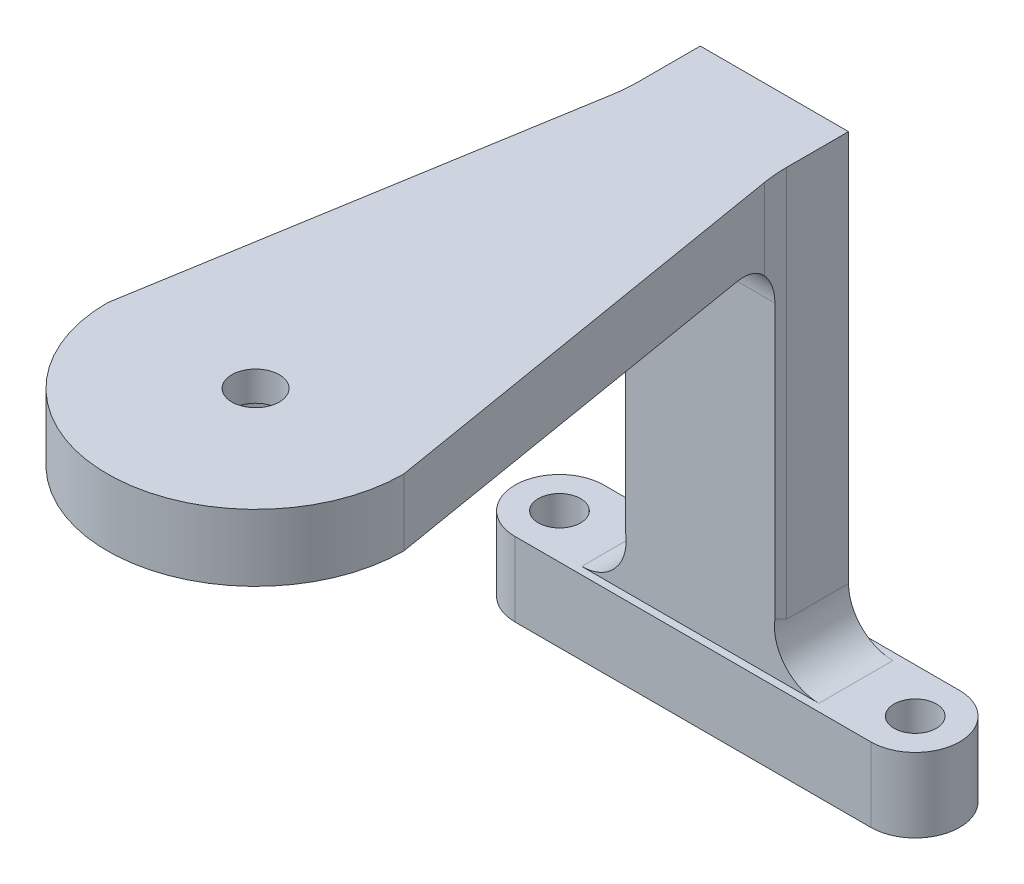
ISO-10303-21;
HEADER;
FILE_DESCRIPTION(('STEP AP214'),'2;1');
FILE_NAME('part.step','',(''),(''),'','','');
FILE_SCHEMA(('AUTOMOTIVE_DESIGN { 1 0 10303 214 1 1 1 1 }'));
ENDSEC;
DATA;
#1=APPLICATION_CONTEXT('core data for automotive mechanical design processes');
#2=APPLICATION_PROTOCOL_DEFINITION('international standard','automotive_design',2000,#1);
#3=PRODUCT_CONTEXT('',#1,'mechanical');
#4=PRODUCT('Part','Part','',(#3));
#5=PRODUCT_RELATED_PRODUCT_CATEGORY('part','',(#4));
#6=PRODUCT_DEFINITION_FORMATION('','',#4);
#7=PRODUCT_DEFINITION_CONTEXT('part definition',#1,'design');
#8=PRODUCT_DEFINITION('design','',#6,#7);
#9=PRODUCT_DEFINITION_SHAPE('','',#8);
#10=(LENGTH_UNIT() NAMED_UNIT(*) SI_UNIT(.MILLI.,.METRE.));
#11=(NAMED_UNIT(*) PLANE_ANGLE_UNIT() SI_UNIT($,.RADIAN.));
#12=(NAMED_UNIT(*) SI_UNIT($,.STERADIAN.) SOLID_ANGLE_UNIT());
#13=UNCERTAINTY_MEASURE_WITH_UNIT(LENGTH_MEASURE(1.E-05),#10,'distance_accuracy_value','');
#14=(GEOMETRIC_REPRESENTATION_CONTEXT(3) GLOBAL_UNCERTAINTY_ASSIGNED_CONTEXT((#13)) GLOBAL_UNIT_ASSIGNED_CONTEXT((#10,
#11,#12)) REPRESENTATION_CONTEXT('',''));
#15=CARTESIAN_POINT('',(0.,0.,0.));
#16=DIRECTION('',(0.,0.,1.));
#17=DIRECTION('',(1.,0.,0.));
#18=AXIS2_PLACEMENT_3D('',#15,#16,#17);
#19=CARTESIAN_POINT('',(10.,0.,0.));
#20=DIRECTION('',(0.,1.,0.));
#21=DIRECTION('',(0.,0.,1.));
#22=AXIS2_PLACEMENT_3D('',#19,#20,#21);
#23=PLANE('',#22);
#24=DIRECTION('',(0.164398987305357,0.,-0.986393923832144));
#25=VECTOR('',#24,1.);
#26=CARTESIAN_POINT('',(0.270270270270269,0.,-1.62162162162162));
#27=LINE('',#26,#25);
#28=CARTESIAN_POINT('',(0.,0.,0.));
#29=VERTEX_POINT('',#28);
#30=CARTESIAN_POINT('',(4.5,0.,-27.));
#31=VERTEX_POINT('',#30);
#32=EDGE_CURVE('E173',#29,#31,#27,.T.);
#33=ORIENTED_EDGE('',*,*,#32,.T.);
#34=DIRECTION('',(-1.,0.,0.));
#35=VECTOR('',#34,1.);
#36=CARTESIAN_POINT('',(15.,0.,-27.));
#37=LINE('',#36,#35);
#38=CARTESIAN_POINT('',(15.5,0.,-27.));
#39=VERTEX_POINT('',#38);
#40=EDGE_CURVE('E229',#31,#39,#37,.F.);
#41=ORIENTED_EDGE('',*,*,#40,.T.);
#42=DIRECTION('',(0.164398987305357,0.,0.986393923832144));
#43=VECTOR('',#42,1.);
#44=CARTESIAN_POINT('',(19.7297297297297,0.,-1.62162162162162));
#45=LINE('',#44,#43);
#46=CARTESIAN_POINT('',(20.,0.,0.));
#47=VERTEX_POINT('',#46);
#48=EDGE_CURVE('E612',#39,#47,#45,.T.);
#49=ORIENTED_EDGE('',*,*,#48,.T.);
#50=CARTESIAN_POINT('',(10.,0.,0.));
#51=DIRECTION('',(0.,1.,0.));
#52=DIRECTION('',(0.,0.,1.));
#53=AXIS2_PLACEMENT_3D('',#50,#51,#52);
#54=CIRCLE('',#53,10.);
#55=EDGE_CURVE('E179',#29,#47,#54,.T.);
#56=ORIENTED_EDGE('',*,*,#55,.F.);
#57=EDGE_LOOP('',(#33,#41,#49,#56));
#58=FACE_BOUND('',#57,.T.);
#59=CARTESIAN_POINT('',(10.,0.,0.));
#60=DIRECTION('',(0.,1.,0.));
#61=DIRECTION('',(0.,0.,1.));
#62=AXIS2_PLACEMENT_3D('',#59,#60,#61);
#63=CIRCLE('',#62,3.);
#64=CARTESIAN_POINT('',(10.,0.,3.));
#65=VERTEX_POINT('',#64);
#66=EDGE_CURVE('E198',#65,#65,#63,.T.);
#67=ORIENTED_EDGE('',*,*,#66,.T.);
#68=EDGE_LOOP('',(#67));
#69=FACE_BOUND('',#68,.T.);
#70=ADVANCED_FACE('F42',(#58,#69),#23,.F.);
#71=CARTESIAN_POINT('',(10.,2.5,0.));
#72=DIRECTION('',(0.,-1.,0.));
#73=DIRECTION('',(0.,0.,-1.));
#74=AXIS2_PLACEMENT_3D('',#71,#72,#73);
#75=CYLINDRICAL_SURFACE('',#74,10.);
#76=ORIENTED_EDGE('',*,*,#55,.T.);
#77=DIRECTION('',(0.,-1.,0.));
#78=VECTOR('',#77,1.);
#79=CARTESIAN_POINT('',(20.,2.5,0.));
#80=LINE('',#79,#78);
#81=CARTESIAN_POINT('',(20.,4.5,0.));
#82=VERTEX_POINT('',#81);
#83=EDGE_CURVE('E178',#82,#47,#80,.T.);
#84=ORIENTED_EDGE('',*,*,#83,.F.);
#85=CARTESIAN_POINT('',(10.,4.5,0.));
#86=DIRECTION('',(0.,1.,0.));
#87=DIRECTION('',(0.,0.,1.));
#88=AXIS2_PLACEMENT_3D('',#85,#86,#87);
#89=CIRCLE('',#88,10.);
#90=CARTESIAN_POINT('',(0.,4.5,0.));
#91=VERTEX_POINT('',#90);
#92=EDGE_CURVE('E186',#91,#82,#89,.T.);
#93=ORIENTED_EDGE('',*,*,#92,.F.);
#94=DIRECTION('',(0.,-1.,0.));
#95=VECTOR('',#94,1.);
#96=CARTESIAN_POINT('',(0.,2.5,0.));
#97=LINE('',#96,#95);
#98=EDGE_CURVE('E167',#91,#29,#97,.T.);
#99=ORIENTED_EDGE('',*,*,#98,.T.);
#100=EDGE_LOOP('',(#76,#84,#93,#99));
#101=FACE_BOUND('',#100,.T.);
#102=ADVANCED_FACE('F192',(#101),#75,.T.);
#103=CARTESIAN_POINT('',(10.,2.5,0.));
#104=DIRECTION('',(0.,-1.,0.));
#105=DIRECTION('',(0.,0.,-1.));
#106=AXIS2_PLACEMENT_3D('',#103,#104,#105);
#107=CYLINDRICAL_SURFACE('',#106,3.);
#108=CARTESIAN_POINT('',(10.,2.5,0.));
#109=DIRECTION('',(0.,1.,0.));
#110=DIRECTION('',(0.,0.,1.));
#111=AXIS2_PLACEMENT_3D('',#108,#109,#110);
#112=CIRCLE('',#111,3.);
#113=CARTESIAN_POINT('',(10.,2.5,3.));
#114=VERTEX_POINT('',#113);
#115=EDGE_CURVE('E194',#114,#114,#112,.T.);
#116=ORIENTED_EDGE('',*,*,#115,.T.);
#117=EDGE_LOOP('',(#116));
#118=FACE_BOUND('',#117,.T.);
#119=ORIENTED_EDGE('',*,*,#66,.F.);
#120=EDGE_LOOP('',(#119));
#121=FACE_BOUND('',#120,.T.);
#122=ADVANCED_FACE('F340',(#118,#121),#107,.F.);
#123=CARTESIAN_POINT('',(10.,2.5,0.));
#124=DIRECTION('',(0.,1.,0.));
#125=DIRECTION('',(0.,0.,1.));
#126=AXIS2_PLACEMENT_3D('',#123,#124,#125);
#127=PLANE('',#126);
#128=CARTESIAN_POINT('',(10.,2.5,0.));
#129=DIRECTION('',(0.,1.,0.));
#130=DIRECTION('',(0.,0.,1.));
#131=AXIS2_PLACEMENT_3D('',#128,#129,#130);
#132=CIRCLE('',#131,1.6);
#133=CARTESIAN_POINT('',(10.,2.5,1.6));
#134=VERTEX_POINT('',#133);
#135=EDGE_CURVE('E201',#134,#134,#132,.T.);
#136=ORIENTED_EDGE('',*,*,#135,.T.);
#137=EDGE_LOOP('',(#136));
#138=FACE_BOUND('',#137,.T.);
#139=ORIENTED_EDGE('',*,*,#115,.F.);
#140=EDGE_LOOP('',(#139));
#141=FACE_BOUND('',#140,.T.);
#142=ADVANCED_FACE('F320',(#138,#141),#127,.F.);
#143=CARTESIAN_POINT('',(10.,4.5,0.));
#144=DIRECTION('',(0.,1.,0.));
#145=DIRECTION('',(0.,0.,1.));
#146=AXIS2_PLACEMENT_3D('',#143,#144,#145);
#147=PLANE('',#146);
#148=DIRECTION('',(0.164398987305357,0.,-0.986393923832144));
#149=VECTOR('',#148,1.);
#150=CARTESIAN_POINT('',(5.,4.5,-30.));
#151=LINE('',#150,#149);
#152=CARTESIAN_POINT('',(4.86393923832144,4.5,-29.1836354299286));
#153=VERTEX_POINT('',#152);
#154=EDGE_CURVE('E170',#91,#153,#151,.T.);
#155=ORIENTED_EDGE('',*,*,#154,.F.);
#156=ORIENTED_EDGE('',*,*,#92,.T.);
#157=DIRECTION('',(0.164398987305357,0.,0.986393923832144));
#158=VECTOR('',#157,1.);
#159=CARTESIAN_POINT('',(15.,4.5,-30.));
#160=LINE('',#159,#158);
#161=CARTESIAN_POINT('',(15.1360607616786,4.5,-29.1836354299286));
#162=VERTEX_POINT('',#161);
#163=EDGE_CURVE('E189',#162,#82,#160,.T.);
#164=ORIENTED_EDGE('',*,*,#163,.F.);
#165=CARTESIAN_POINT('',(25.,4.5,-30.8276253029822));
#166=DIRECTION('',(0.,1.,0.));
#167=DIRECTION('',(0.,0.,1.));
#168=AXIS2_PLACEMENT_3D('',#165,#166,#167);
#169=CIRCLE('',#168,10.);
#170=CARTESIAN_POINT('',(15.,4.5,-30.8276253029822));
#171=VERTEX_POINT('',#170);
#172=EDGE_CURVE('E609',#162,#171,#169,.F.);
#173=ORIENTED_EDGE('',*,*,#172,.T.);
#174=DIRECTION('',(0.,0.,1.));
#175=VECTOR('',#174,1.);
#176=CARTESIAN_POINT('',(15.,4.5,-35.));
#177=LINE('',#176,#175);
#178=CARTESIAN_POINT('',(15.,4.5,-35.));
#179=VERTEX_POINT('',#178);
#180=EDGE_CURVE('E306',#179,#171,#177,.T.);
#181=ORIENTED_EDGE('',*,*,#180,.F.);
#182=DIRECTION('',(1.,0.,0.));
#183=VECTOR('',#182,1.);
#184=CARTESIAN_POINT('',(15.,4.5,-35.));
#185=LINE('',#184,#183);
#186=CARTESIAN_POINT('',(5.,4.5,-35.));
#187=VERTEX_POINT('',#186);
#188=EDGE_CURVE('E303',#187,#179,#185,.T.);
#189=ORIENTED_EDGE('',*,*,#188,.F.);
#190=DIRECTION('',(0.,0.,1.));
#191=VECTOR('',#190,1.);
#192=CARTESIAN_POINT('',(5.,4.5,-35.));
#193=LINE('',#192,#191);
#194=CARTESIAN_POINT('',(5.,4.5,-30.8276253029822));
#195=VERTEX_POINT('',#194);
#196=EDGE_CURVE('E300',#187,#195,#193,.T.);
#197=ORIENTED_EDGE('',*,*,#196,.T.);
#198=CARTESIAN_POINT('',(-5.,4.5,-30.8276253029822));
#199=DIRECTION('',(0.,1.,0.));
#200=DIRECTION('',(0.,0.,1.));
#201=AXIS2_PLACEMENT_3D('',#198,#199,#200);
#202=CIRCLE('',#201,10.);
#203=EDGE_CURVE('E188',#195,#153,#202,.F.);
#204=ORIENTED_EDGE('',*,*,#203,.T.);
#205=EDGE_LOOP('',(#155,#156,#164,#173,#181,#189,#197,#204));
#206=FACE_BOUND('',#205,.T.);
#207=CARTESIAN_POINT('',(10.,4.5,0.));
#208=DIRECTION('',(0.,1.,0.));
#209=DIRECTION('',(0.,0.,1.));
#210=AXIS2_PLACEMENT_3D('',#207,#208,#209);
#211=CIRCLE('',#210,1.6);
#212=CARTESIAN_POINT('',(10.,4.5,1.6));
#213=VERTEX_POINT('',#212);
#214=EDGE_CURVE('E195',#213,#213,#211,.T.);
#215=ORIENTED_EDGE('',*,*,#214,.F.);
#216=EDGE_LOOP('',(#215));
#217=FACE_BOUND('',#216,.T.);
#218=ADVANCED_FACE('F183',(#206,#217),#147,.T.);
#219=CARTESIAN_POINT('',(10.,4.5,0.));
#220=DIRECTION('',(0.,-1.,0.));
#221=DIRECTION('',(0.,0.,-1.));
#222=AXIS2_PLACEMENT_3D('',#219,#220,#221);
#223=CYLINDRICAL_SURFACE('',#222,1.6);
#224=ORIENTED_EDGE('',*,*,#214,.T.);
#225=EDGE_LOOP('',(#224));
#226=FACE_BOUND('',#225,.T.);
#227=ORIENTED_EDGE('',*,*,#135,.F.);
#228=EDGE_LOOP('',(#227));
#229=FACE_BOUND('',#228,.T.);
#230=ADVANCED_FACE('F323',(#226,#229),#223,.F.);
#231=CARTESIAN_POINT('',(0.,0.,-30.));
#232=DIRECTION('',(0.,0.,-1.));
#233=DIRECTION('',(-1.,0.,0.));
#234=AXIS2_PLACEMENT_3D('',#231,#232,#233);
#235=PLANE('',#234);
#236=CARTESIAN_POINT('',(18.,-21.9,-30.));
#237=DIRECTION('',(0.,0.,-1.));
#238=DIRECTION('',(-1.,0.,0.));
#239=AXIS2_PLACEMENT_3D('',#236,#237,#238);
#240=CIRCLE('',#239,3.);
#241=CARTESIAN_POINT('',(18.,-24.9,-30.));
#242=VERTEX_POINT('',#241);
#243=CARTESIAN_POINT('',(15.0343070307247,-21.4476006056691,-30.));
#244=VERTEX_POINT('',#243);
#245=EDGE_CURVE('E220',#242,#244,#240,.T.);
#246=ORIENTED_EDGE('',*,*,#245,.T.);
#247=DIRECTION('',(0.,1.,0.));
#248=VECTOR('',#247,1.);
#249=CARTESIAN_POINT('',(15.0343070307247,-21.4476006056691,-30.));
#250=LINE('',#249,#248);
#251=CARTESIAN_POINT('',(15.0343070307247,-3.,-30.));
#252=VERTEX_POINT('',#251);
#253=EDGE_CURVE('E254',#244,#252,#250,.T.);
#254=ORIENTED_EDGE('',*,*,#253,.T.);
#255=DIRECTION('',(-1.,0.,0.));
#256=VECTOR('',#255,1.);
#257=CARTESIAN_POINT('',(5.,-3.,-30.));
#258=LINE('',#257,#256);
#259=CARTESIAN_POINT('',(4.96569296927532,-3.,-30.));
#260=VERTEX_POINT('',#259);
#261=EDGE_CURVE('E63',#252,#260,#258,.T.);
#262=ORIENTED_EDGE('',*,*,#261,.T.);
#263=DIRECTION('',(0.,-1.,0.));
#264=VECTOR('',#263,1.);
#265=CARTESIAN_POINT('',(4.96569296927532,-3.,-30.));
#266=LINE('',#265,#264);
#267=CARTESIAN_POINT('',(4.96569296927532,-21.4476006056692,-30.));
#268=VERTEX_POINT('',#267);
#269=EDGE_CURVE('E56',#260,#268,#266,.T.);
#270=ORIENTED_EDGE('',*,*,#269,.T.);
#271=CARTESIAN_POINT('',(1.99999999999999,-21.9,-30.));
#272=DIRECTION('',(0.,0.,-1.));
#273=DIRECTION('',(-1.,0.,0.));
#274=AXIS2_PLACEMENT_3D('',#271,#272,#273);
#275=CIRCLE('',#274,3.);
#276=CARTESIAN_POINT('',(1.99999999999999,-24.9,-30.));
#277=VERTEX_POINT('',#276);
#278=EDGE_CURVE('E70',#268,#277,#275,.T.);
#279=ORIENTED_EDGE('',*,*,#278,.T.);
#280=DIRECTION('',(-1.,0.,0.));
#281=VECTOR('',#280,1.);
#282=CARTESIAN_POINT('',(15.,-24.9,-30.));
#283=LINE('',#282,#281);
#284=EDGE_CURVE('E312',#242,#277,#283,.T.);
#285=ORIENTED_EDGE('',*,*,#284,.F.);
#286=EDGE_LOOP('',(#246,#254,#262,#270,#279,#285));
#287=FACE_BOUND('',#286,.T.);
#288=ADVANCED_FACE('F289',(#287),#235,.F.);
#289=CARTESIAN_POINT('',(15.,4.5,-35.));
#290=DIRECTION('',(-1.,0.,0.));
#291=DIRECTION('',(0.,-1.,0.));
#292=AXIS2_PLACEMENT_3D('',#289,#290,#291);
#293=PLANE('',#292);
#294=ORIENTED_EDGE('',*,*,#180,.T.);
#295=DIRECTION('',(0.,-1.,0.));
#296=VECTOR('',#295,1.);
#297=CARTESIAN_POINT('',(15.,-3.,-30.8276253029822));
#298=LINE('',#297,#296);
#299=CARTESIAN_POINT('',(15.,-21.9,-30.8276253029822));
#300=VERTEX_POINT('',#299);
#301=EDGE_CURVE('E236',#171,#300,#298,.T.);
#302=ORIENTED_EDGE('',*,*,#301,.T.);
#303=DIRECTION('',(0.,0.,1.));
#304=VECTOR('',#303,1.);
#305=CARTESIAN_POINT('',(15.,-21.9,-35.));
#306=LINE('',#305,#304);
#307=CARTESIAN_POINT('',(15.,-21.9,-35.));
#308=VERTEX_POINT('',#307);
#309=EDGE_CURVE('E215',#300,#308,#306,.F.);
#310=ORIENTED_EDGE('',*,*,#309,.T.);
#311=DIRECTION('',(0.,-1.,0.));
#312=VECTOR('',#311,1.);
#313=CARTESIAN_POINT('',(15.,4.5,-35.));
#314=LINE('',#313,#312);
#315=EDGE_CURVE('E308',#179,#308,#314,.T.);
#316=ORIENTED_EDGE('',*,*,#315,.F.);
#317=EDGE_LOOP('',(#294,#302,#310,#316));
#318=FACE_BOUND('',#317,.T.);
#319=ADVANCED_FACE('F331',(#318),#293,.F.);
#320=CARTESIAN_POINT('',(5.,4.5,-35.));
#321=DIRECTION('',(1.,0.,0.));
#322=DIRECTION('',(0.,1.,0.));
#323=AXIS2_PLACEMENT_3D('',#320,#321,#322);
#324=PLANE('',#323);
#325=DIRECTION('',(0.,0.,1.));
#326=VECTOR('',#325,1.);
#327=CARTESIAN_POINT('',(4.99999999999999,-21.9,-30.));
#328=LINE('',#327,#326);
#329=CARTESIAN_POINT('',(4.99999999999999,-21.9,-35.));
#330=VERTEX_POINT('',#329);
#331=CARTESIAN_POINT('',(4.99999999999999,-21.9,-30.8276253029822));
#332=VERTEX_POINT('',#331);
#333=EDGE_CURVE('E217',#330,#332,#328,.T.);
#334=ORIENTED_EDGE('',*,*,#333,.T.);
#335=DIRECTION('',(0.,1.,0.));
#336=VECTOR('',#335,1.);
#337=CARTESIAN_POINT('',(5.,4.5,-30.8276253029822));
#338=LINE('',#337,#336);
#339=EDGE_CURVE('E241',#332,#195,#338,.T.);
#340=ORIENTED_EDGE('',*,*,#339,.T.);
#341=ORIENTED_EDGE('',*,*,#196,.F.);
#342=DIRECTION('',(0.,1.,0.));
#343=VECTOR('',#342,1.);
#344=CARTESIAN_POINT('',(5.,4.5,-35.));
#345=LINE('',#344,#343);
#346=EDGE_CURVE('E299',#330,#187,#345,.T.);
#347=ORIENTED_EDGE('',*,*,#346,.F.);
#348=EDGE_LOOP('',(#334,#340,#341,#347));
#349=FACE_BOUND('',#348,.T.);
#350=ADVANCED_FACE('F297',(#349),#324,.F.);
#351=CARTESIAN_POINT('',(0.,0.,-35.));
#352=DIRECTION('',(0.,0.,-1.));
#353=DIRECTION('',(-1.,0.,0.));
#354=AXIS2_PLACEMENT_3D('',#351,#352,#353);
#355=PLANE('',#354);
#356=ORIENTED_EDGE('',*,*,#315,.T.);
#357=CARTESIAN_POINT('',(18.,-21.9,-35.));
#358=DIRECTION('',(0.,0.,-1.));
#359=DIRECTION('',(-1.,0.,0.));
#360=AXIS2_PLACEMENT_3D('',#357,#358,#359);
#361=CIRCLE('',#360,3.);
#362=CARTESIAN_POINT('',(18.,-24.9,-35.));
#363=VERTEX_POINT('',#362);
#364=EDGE_CURVE('E222',#308,#363,#361,.F.);
#365=ORIENTED_EDGE('',*,*,#364,.T.);
#366=DIRECTION('',(-1.,0.,0.));
#367=VECTOR('',#366,1.);
#368=CARTESIAN_POINT('',(15.,-24.9,-35.));
#369=LINE('',#368,#367);
#370=CARTESIAN_POINT('',(1.99999999999999,-24.9,-35.));
#371=VERTEX_POINT('',#370);
#372=EDGE_CURVE('E304',#363,#371,#369,.T.);
#373=ORIENTED_EDGE('',*,*,#372,.T.);
#374=CARTESIAN_POINT('',(1.99999999999999,-21.9,-35.));
#375=DIRECTION('',(0.,0.,-1.));
#376=DIRECTION('',(-1.,0.,0.));
#377=AXIS2_PLACEMENT_3D('',#374,#375,#376);
#378=CIRCLE('',#377,3.);
#379=EDGE_CURVE('E226',#371,#330,#378,.F.);
#380=ORIENTED_EDGE('',*,*,#379,.T.);
#381=ORIENTED_EDGE('',*,*,#346,.T.);
#382=ORIENTED_EDGE('',*,*,#188,.T.);
#383=EDGE_LOOP('',(#356,#365,#373,#380,#381,#382));
#384=FACE_BOUND('',#383,.T.);
#385=ADVANCED_FACE('F385',(#384),#355,.T.);
#386=CARTESIAN_POINT('',(22.,-24.9,-32.5));
#387=DIRECTION('',(0.,-1.,0.));
#388=DIRECTION('',(1.,0.,0.));
#389=AXIS2_PLACEMENT_3D('',#386,#387,#388);
#390=PLANE('',#389);
#391=CARTESIAN_POINT('',(22.,-24.9,-32.5));
#392=DIRECTION('',(0.,-1.,0.));
#393=DIRECTION('',(1.,0.,0.));
#394=AXIS2_PLACEMENT_3D('',#391,#392,#393);
#395=CIRCLE('',#394,3.);
#396=CARTESIAN_POINT('',(22.,-24.9,-35.5));
#397=VERTEX_POINT('',#396);
#398=CARTESIAN_POINT('',(22.,-24.9,-29.5));
#399=VERTEX_POINT('',#398);
#400=EDGE_CURVE('E629',#397,#399,#395,.T.);
#401=ORIENTED_EDGE('',*,*,#400,.F.);
#402=DIRECTION('',(1.,0.,0.));
#403=VECTOR('',#402,1.);
#404=CARTESIAN_POINT('',(22.,-24.9,-35.5));
#405=LINE('',#404,#403);
#406=CARTESIAN_POINT('',(-2.00000000000001,-24.9,-35.5));
#407=VERTEX_POINT('',#406);
#408=EDGE_CURVE('E636',#407,#397,#405,.T.);
#409=ORIENTED_EDGE('',*,*,#408,.F.);
#410=CARTESIAN_POINT('',(-2.00000000000001,-24.9,-32.5));
#411=DIRECTION('',(0.,-1.,0.));
#412=DIRECTION('',(1.,0.,0.));
#413=AXIS2_PLACEMENT_3D('',#410,#411,#412);
#414=CIRCLE('',#413,3.);
#415=CARTESIAN_POINT('',(-2.00000000000001,-24.9,-29.5));
#416=VERTEX_POINT('',#415);
#417=EDGE_CURVE('E647',#416,#407,#414,.T.);
#418=ORIENTED_EDGE('',*,*,#417,.F.);
#419=DIRECTION('',(-1.,0.,0.));
#420=VECTOR('',#419,1.);
#421=CARTESIAN_POINT('',(22.,-24.9,-29.5));
#422=LINE('',#421,#420);
#423=EDGE_CURVE('E645',#399,#416,#422,.T.);
#424=ORIENTED_EDGE('',*,*,#423,.F.);
#425=EDGE_LOOP('',(#401,#409,#418,#424));
#426=FACE_BOUND('',#425,.T.);
#427=CARTESIAN_POINT('',(-2.00000000000001,-24.9,-32.5));
#428=DIRECTION('',(0.,-1.,0.));
#429=DIRECTION('',(1.,0.,0.));
#430=AXIS2_PLACEMENT_3D('',#427,#428,#429);
#431=CIRCLE('',#430,1.425);
#432=CARTESIAN_POINT('',(-0.575000000000011,-24.9,-32.5));
#433=VERTEX_POINT('',#432);
#434=EDGE_CURVE('E623',#433,#433,#431,.T.);
#435=ORIENTED_EDGE('',*,*,#434,.T.);
#436=EDGE_LOOP('',(#435));
#437=FACE_BOUND('',#436,.T.);
#438=CARTESIAN_POINT('',(22.,-24.9,-32.5));
#439=DIRECTION('',(0.,-1.,0.));
#440=DIRECTION('',(1.,0.,0.));
#441=AXIS2_PLACEMENT_3D('',#438,#439,#440);
#442=CIRCLE('',#441,1.42499999999999);
#443=CARTESIAN_POINT('',(23.425,-24.9,-32.5));
#444=VERTEX_POINT('',#443);
#445=EDGE_CURVE('E616',#444,#444,#442,.T.);
#446=ORIENTED_EDGE('',*,*,#445,.T.);
#447=EDGE_LOOP('',(#446));
#448=FACE_BOUND('',#447,.T.);
#449=DIRECTION('',(0.,0.,1.));
#450=VECTOR('',#449,1.);
#451=CARTESIAN_POINT('',(18.,-24.9,-30.));
#452=LINE('',#451,#450);
#453=EDGE_CURVE('E212',#363,#242,#452,.T.);
#454=ORIENTED_EDGE('',*,*,#453,.T.);
#455=ORIENTED_EDGE('',*,*,#284,.T.);
#456=DIRECTION('',(0.,0.,1.));
#457=VECTOR('',#456,1.);
#458=CARTESIAN_POINT('',(1.99999999999999,-24.9,-35.));
#459=LINE('',#458,#457);
#460=EDGE_CURVE('E209',#277,#371,#459,.F.);
#461=ORIENTED_EDGE('',*,*,#460,.T.);
#462=ORIENTED_EDGE('',*,*,#372,.F.);
#463=EDGE_LOOP('',(#454,#455,#461,#462));
#464=FACE_BOUND('',#463,.T.);
#465=ADVANCED_FACE('F522',(#426,#437,#448,#464),#390,.F.);
#466=CARTESIAN_POINT('',(22.,-29.9,-32.5));
#467=DIRECTION('',(0.,-1.,0.));
#468=DIRECTION('',(1.,0.,0.));
#469=AXIS2_PLACEMENT_3D('',#466,#467,#468);
#470=PLANE('',#469);
#471=CARTESIAN_POINT('',(-2.00000000000002,-29.9,-32.5));
#472=DIRECTION('',(0.,-1.,0.));
#473=DIRECTION('',(1.,0.,0.));
#474=AXIS2_PLACEMENT_3D('',#471,#472,#473);
#475=CIRCLE('',#474,1.425);
#476=CARTESIAN_POINT('',(-0.575000000000013,-29.9,-32.5));
#477=VERTEX_POINT('',#476);
#478=EDGE_CURVE('E626',#477,#477,#475,.T.);
#479=ORIENTED_EDGE('',*,*,#478,.F.);
#480=EDGE_LOOP('',(#479));
#481=FACE_BOUND('',#480,.T.);
#482=CARTESIAN_POINT('',(22.,-29.9,-32.5));
#483=DIRECTION('',(0.,-1.,0.));
#484=DIRECTION('',(1.,0.,0.));
#485=AXIS2_PLACEMENT_3D('',#482,#483,#484);
#486=CIRCLE('',#485,3.);
#487=CARTESIAN_POINT('',(22.,-29.9,-35.5));
#488=VERTEX_POINT('',#487);
#489=CARTESIAN_POINT('',(22.,-29.9,-29.5));
#490=VERTEX_POINT('',#489);
#491=EDGE_CURVE('E632',#488,#490,#486,.T.);
#492=ORIENTED_EDGE('',*,*,#491,.T.);
#493=DIRECTION('',(-1.,0.,0.));
#494=VECTOR('',#493,1.);
#495=CARTESIAN_POINT('',(22.,-29.9,-29.5));
#496=LINE('',#495,#494);
#497=CARTESIAN_POINT('',(-2.00000000000001,-29.9,-29.5));
#498=VERTEX_POINT('',#497);
#499=EDGE_CURVE('E635',#490,#498,#496,.T.);
#500=ORIENTED_EDGE('',*,*,#499,.T.);
#501=CARTESIAN_POINT('',(-2.00000000000002,-29.9,-32.5));
#502=DIRECTION('',(0.,-1.,0.));
#503=DIRECTION('',(1.,0.,0.));
#504=AXIS2_PLACEMENT_3D('',#501,#502,#503);
#505=CIRCLE('',#504,3.);
#506=CARTESIAN_POINT('',(-2.00000000000001,-29.9,-35.5));
#507=VERTEX_POINT('',#506);
#508=EDGE_CURVE('E638',#498,#507,#505,.T.);
#509=ORIENTED_EDGE('',*,*,#508,.T.);
#510=DIRECTION('',(1.,0.,0.));
#511=VECTOR('',#510,1.);
#512=CARTESIAN_POINT('',(22.,-29.9,-35.5));
#513=LINE('',#512,#511);
#514=EDGE_CURVE('E640',#507,#488,#513,.T.);
#515=ORIENTED_EDGE('',*,*,#514,.T.);
#516=EDGE_LOOP('',(#492,#500,#509,#515));
#517=FACE_BOUND('',#516,.T.);
#518=CARTESIAN_POINT('',(22.,-29.9,-32.5));
#519=DIRECTION('',(0.,-1.,0.));
#520=DIRECTION('',(1.,0.,0.));
#521=AXIS2_PLACEMENT_3D('',#518,#519,#520);
#522=CIRCLE('',#521,1.42499999999999);
#523=CARTESIAN_POINT('',(23.425,-29.9,-32.5));
#524=VERTEX_POINT('',#523);
#525=EDGE_CURVE('E620',#524,#524,#522,.T.);
#526=ORIENTED_EDGE('',*,*,#525,.F.);
#527=EDGE_LOOP('',(#526));
#528=FACE_BOUND('',#527,.T.);
#529=ADVANCED_FACE('F512',(#481,#517,#528),#470,.T.);
#530=CARTESIAN_POINT('',(22.,-29.9,-32.5));
#531=DIRECTION('',(0.,1.,0.));
#532=DIRECTION('',(-1.,0.,0.));
#533=AXIS2_PLACEMENT_3D('',#530,#531,#532);
#534=CYLINDRICAL_SURFACE('',#533,3.);
#535=ORIENTED_EDGE('',*,*,#400,.T.);
#536=DIRECTION('',(0.,1.,0.));
#537=VECTOR('',#536,1.);
#538=CARTESIAN_POINT('',(22.,-29.9,-29.5));
#539=LINE('',#538,#537);
#540=EDGE_CURVE('E314',#490,#399,#539,.T.);
#541=ORIENTED_EDGE('',*,*,#540,.F.);
#542=ORIENTED_EDGE('',*,*,#491,.F.);
#543=DIRECTION('',(0.,1.,0.));
#544=VECTOR('',#543,1.);
#545=CARTESIAN_POINT('',(22.,-29.9,-35.5));
#546=LINE('',#545,#544);
#547=EDGE_CURVE('E642',#488,#397,#546,.T.);
#548=ORIENTED_EDGE('',*,*,#547,.T.);
#549=EDGE_LOOP('',(#535,#541,#542,#548));
#550=FACE_BOUND('',#549,.T.);
#551=ADVANCED_FACE('F502',(#550),#534,.T.);
#552=CARTESIAN_POINT('',(22.,-29.9,-29.5));
#553=DIRECTION('',(0.,0.,-1.));
#554=DIRECTION('',(-1.,0.,0.));
#555=AXIS2_PLACEMENT_3D('',#552,#553,#554);
#556=PLANE('',#555);
#557=ORIENTED_EDGE('',*,*,#423,.T.);
#558=DIRECTION('',(0.,1.,0.));
#559=VECTOR('',#558,1.);
#560=CARTESIAN_POINT('',(-2.00000000000001,-29.9,-29.5));
#561=LINE('',#560,#559);
#562=EDGE_CURVE('E655',#498,#416,#561,.T.);
#563=ORIENTED_EDGE('',*,*,#562,.F.);
#564=ORIENTED_EDGE('',*,*,#499,.F.);
#565=ORIENTED_EDGE('',*,*,#540,.T.);
#566=EDGE_LOOP('',(#557,#563,#564,#565));
#567=FACE_BOUND('',#566,.T.);
#568=ADVANCED_FACE('F492',(#567),#556,.F.);
#569=CARTESIAN_POINT('',(-2.00000000000002,-29.9,-32.5));
#570=DIRECTION('',(0.,1.,0.));
#571=DIRECTION('',(-1.,0.,0.));
#572=AXIS2_PLACEMENT_3D('',#569,#570,#571);
#573=CYLINDRICAL_SURFACE('',#572,3.);
#574=ORIENTED_EDGE('',*,*,#417,.T.);
#575=DIRECTION('',(0.,1.,0.));
#576=VECTOR('',#575,1.);
#577=CARTESIAN_POINT('',(-2.00000000000001,-29.9,-35.5));
#578=LINE('',#577,#576);
#579=EDGE_CURVE('E652',#507,#407,#578,.T.);
#580=ORIENTED_EDGE('',*,*,#579,.F.);
#581=ORIENTED_EDGE('',*,*,#508,.F.);
#582=ORIENTED_EDGE('',*,*,#562,.T.);
#583=EDGE_LOOP('',(#574,#580,#581,#582));
#584=FACE_BOUND('',#583,.T.);
#585=ADVANCED_FACE('F482',(#584),#573,.T.);
#586=CARTESIAN_POINT('',(22.,-29.9,-35.5));
#587=DIRECTION('',(0.,0.,1.));
#588=DIRECTION('',(1.,0.,0.));
#589=AXIS2_PLACEMENT_3D('',#586,#587,#588);
#590=PLANE('',#589);
#591=ORIENTED_EDGE('',*,*,#408,.T.);
#592=ORIENTED_EDGE('',*,*,#547,.F.);
#593=ORIENTED_EDGE('',*,*,#514,.F.);
#594=ORIENTED_EDGE('',*,*,#579,.T.);
#595=EDGE_LOOP('',(#591,#592,#593,#594));
#596=FACE_BOUND('',#595,.T.);
#597=ADVANCED_FACE('F472',(#596),#590,.F.);
#598=CARTESIAN_POINT('',(-2.00000000000002,-29.9,-32.5));
#599=DIRECTION('',(0.,1.,0.));
#600=DIRECTION('',(-1.,0.,0.));
#601=AXIS2_PLACEMENT_3D('',#598,#599,#600);
#602=CYLINDRICAL_SURFACE('',#601,1.425);
#603=ORIENTED_EDGE('',*,*,#478,.T.);
#604=EDGE_LOOP('',(#603));
#605=FACE_BOUND('',#604,.T.);
#606=ORIENTED_EDGE('',*,*,#434,.F.);
#607=EDGE_LOOP('',(#606));
#608=FACE_BOUND('',#607,.T.);
#609=ADVANCED_FACE('F462',(#605,#608),#602,.F.);
#610=CARTESIAN_POINT('',(22.,-29.9,-32.5));
#611=DIRECTION('',(0.,1.,0.));
#612=DIRECTION('',(-1.,0.,0.));
#613=AXIS2_PLACEMENT_3D('',#610,#611,#612);
#614=CYLINDRICAL_SURFACE('',#613,1.42499999999999);
#615=ORIENTED_EDGE('',*,*,#525,.T.);
#616=EDGE_LOOP('',(#615));
#617=FACE_BOUND('',#616,.T.);
#618=ORIENTED_EDGE('',*,*,#445,.F.);
#619=EDGE_LOOP('',(#618));
#620=FACE_BOUND('',#619,.T.);
#621=ADVANCED_FACE('F397',(#617,#620),#614,.F.);
#622=CARTESIAN_POINT('',(5.,-0.5,-30.));
#623=DIRECTION('',(0.986393923832144,0.,0.164398987305357));
#624=DIRECTION('',(0.164398987305357,0.,-0.986393923832144));
#625=AXIS2_PLACEMENT_3D('',#622,#623,#624);
#626=PLANE('',#625);
#627=ORIENTED_EDGE('',*,*,#154,.T.);
#628=DIRECTION('',(0.,1.,0.));
#629=VECTOR('',#628,1.);
#630=CARTESIAN_POINT('',(4.86393923832144,-3.,-29.1836354299286));
#631=LINE('',#630,#629);
#632=CARTESIAN_POINT('',(4.86393923832144,-0.942881551985771,-29.1836354299286));
#633=VERTEX_POINT('',#632);
#634=EDGE_CURVE('E244',#153,#633,#631,.F.);
#635=ORIENTED_EDGE('',*,*,#634,.T.);
#636=CARTESIAN_POINT('',(4.5,-3.,-27.));
#637=DIRECTION('',(0.986393923832144,0.,0.164398987305357));
#638=DIRECTION('',(0.164398987305357,0.,-0.986393923832144));
#639=AXIS2_PLACEMENT_3D('',#636,#637,#638);
#640=ELLIPSE('',#639,3.04138126514911,3.);
#641=EDGE_CURVE('E231',#633,#31,#640,.T.);
#642=ORIENTED_EDGE('',*,*,#641,.T.);
#643=ORIENTED_EDGE('',*,*,#32,.F.);
#644=ORIENTED_EDGE('',*,*,#98,.F.);
#645=EDGE_LOOP('',(#627,#635,#642,#643,#644));
#646=FACE_BOUND('',#645,.T.);
#647=ADVANCED_FACE('F169',(#646),#626,.F.);
#648=CARTESIAN_POINT('',(15.,-0.5,-30.));
#649=DIRECTION('',(-0.986393923832144,0.,0.164398987305357));
#650=DIRECTION('',(0.164398987305357,0.,0.986393923832144));
#651=AXIS2_PLACEMENT_3D('',#648,#649,#650);
#652=PLANE('',#651);
#653=CARTESIAN_POINT('',(15.5,-3.,-27.));
#654=DIRECTION('',(-0.986393923832144,0.,0.164398987305357));
#655=DIRECTION('',(0.164398987305357,0.,0.986393923832144));
#656=AXIS2_PLACEMENT_3D('',#653,#654,#655);
#657=ELLIPSE('',#656,3.04138126514911,3.);
#658=CARTESIAN_POINT('',(15.1360607616786,-0.942881551985794,-29.1836354299286));
#659=VERTEX_POINT('',#658);
#660=EDGE_CURVE('E233',#39,#659,#657,.T.);
#661=ORIENTED_EDGE('',*,*,#660,.T.);
#662=DIRECTION('',(0.,-1.,0.));
#663=VECTOR('',#662,1.);
#664=CARTESIAN_POINT('',(15.1360607616786,4.5,-29.1836354299286));
#665=LINE('',#664,#663);
#666=EDGE_CURVE('E239',#659,#162,#665,.F.);
#667=ORIENTED_EDGE('',*,*,#666,.T.);
#668=ORIENTED_EDGE('',*,*,#163,.T.);
#669=ORIENTED_EDGE('',*,*,#83,.T.);
#670=ORIENTED_EDGE('',*,*,#48,.F.);
#671=EDGE_LOOP('',(#661,#667,#668,#669,#670));
#672=FACE_BOUND('',#671,.T.);
#673=ADVANCED_FACE('F264',(#672),#652,.F.);
#674=CARTESIAN_POINT('',(18.,-21.9,-32.5));
#675=DIRECTION('',(0.,0.,-1.));
#676=DIRECTION('',(-1.,0.,0.));
#677=AXIS2_PLACEMENT_3D('',#674,#675,#676);
#678=CYLINDRICAL_SURFACE('',#677,3.);
#679=ORIENTED_EDGE('',*,*,#364,.F.);
#680=ORIENTED_EDGE('',*,*,#309,.F.);
#681=CARTESIAN_POINT('',(15.0343070307247,-21.4476006056691,-30.));
#682=CARTESIAN_POINT('',(15.0119200098129,-21.5948698459521,-30.2699708342424));
#683=CARTESIAN_POINT('',(15.0004894611159,-21.7424670831836,-30.5399988805709));
#684=CARTESIAN_POINT('',(15.0000051214359,-21.8935947245197,-30.8159311668373));
#685=CARTESIAN_POINT('',(14.9999999932247,-21.8967972853984,-30.8217782215029));
#686=CARTESIAN_POINT('',(15.,-21.9,-30.8276253029822));
#687=B_SPLINE_CURVE_WITH_KNOTS('',3,(#681,#682,#683,#684,#685,#686),.UNSPECIFIED.,.F.,.F.,(4,2,
4),(0.,0.923838042717817,0.943838048635112),.UNSPECIFIED.);
#688=EDGE_CURVE('E246',#300,#244,#687,.F.);
#689=ORIENTED_EDGE('',*,*,#688,.T.);
#690=ORIENTED_EDGE('',*,*,#245,.F.);
#691=ORIENTED_EDGE('',*,*,#453,.F.);
#692=EDGE_LOOP('',(#679,#680,#689,#690,#691));
#693=FACE_BOUND('',#692,.T.);
#694=ADVANCED_FACE('F259',(#693),#678,.F.);
#695=CARTESIAN_POINT('',(1.99999999999999,-21.9,-35.));
#696=DIRECTION('',(0.,0.,-1.));
#697=DIRECTION('',(-1.,0.,0.));
#698=AXIS2_PLACEMENT_3D('',#695,#696,#697);
#699=CYLINDRICAL_SURFACE('',#698,3.);
#700=ORIENTED_EDGE('',*,*,#379,.F.);
#701=ORIENTED_EDGE('',*,*,#460,.F.);
#702=ORIENTED_EDGE('',*,*,#278,.F.);
#703=CARTESIAN_POINT('',(4.96569296927532,-21.4476006056692,-30.));
#704=CARTESIAN_POINT('',(4.98807999018708,-21.594869845945,-30.2699708342463));
#705=CARTESIAN_POINT('',(4.99951053888412,-21.7424670831764,-30.5399988805748));
#706=CARTESIAN_POINT('',(4.99999487856413,-21.8935947245193,-30.8159311668374));
#707=CARTESIAN_POINT('',(5.00000000677531,-21.8967972853983,-30.8217782215029));
#708=CARTESIAN_POINT('',(4.99999999999999,-21.9,-30.8276253029822));
#709=B_SPLINE_CURVE_WITH_KNOTS('',3,(#703,#704,#705,#706,#707,#708),.UNSPECIFIED.,.F.,.F.,(4,2,
4),(0.,0.923838042717736,0.943838048635034),.UNSPECIFIED.);
#710=EDGE_CURVE('E12',#268,#332,#709,.T.);
#711=ORIENTED_EDGE('',*,*,#710,.T.);
#712=ORIENTED_EDGE('',*,*,#333,.F.);
#713=EDGE_LOOP('',(#700,#701,#702,#711,#712));
#714=FACE_BOUND('',#713,.T.);
#715=ADVANCED_FACE('F263',(#714),#699,.F.);
#716=CARTESIAN_POINT('',(0.,-3.,-27.));
#717=DIRECTION('',(1.,0.,0.));
#718=DIRECTION('',(0.,0.,-1.));
#719=AXIS2_PLACEMENT_3D('',#716,#717,#718);
#720=CYLINDRICAL_SURFACE('',#719,3.);
#721=ORIENTED_EDGE('',*,*,#660,.F.);
#722=ORIENTED_EDGE('',*,*,#40,.F.);
#723=ORIENTED_EDGE('',*,*,#641,.F.);
#724=CARTESIAN_POINT('',(4.86393923832144,-0.942881551985771,-29.1836354299286));
#725=CARTESIAN_POINT('',(4.87340735506758,-1.00317288488046,-29.2404481534976));
#726=CARTESIAN_POINT('',(4.88196461510881,-1.06590304000191,-29.2948152218639));
#727=CARTESIAN_POINT('',(4.89745595195461,-1.19576754507658,-29.3982534105065));
#728=CARTESIAN_POINT('',(4.9043901558284,-1.26290154972484,-29.4473249452085));
#729=CARTESIAN_POINT('',(4.91683947668902,-1.40115593244624,-29.539807249069));
#730=CARTESIAN_POINT('',(4.92235364518841,-1.47227893648452,-29.5832142251896));
#731=CARTESIAN_POINT('',(4.93214960478001,-1.61793123230576,-29.6639872325056));
#732=CARTESIAN_POINT('',(4.93643144126506,-1.69246039850585,-29.7013534861881));
#733=CARTESIAN_POINT('',(4.94770927477782,-1.92042836959177,-29.8039705092349));
#734=CARTESIAN_POINT('',(4.95314313943003,-2.07831410583979,-29.8597839355473));
#735=CARTESIAN_POINT('',(4.96100112922923,-2.40091803570489,-29.9442892267803));
#736=CARTESIAN_POINT('',(4.96343177139184,-2.56562063054689,-29.9730397859001));
#737=CARTESIAN_POINT('',(4.96502255322299,-2.7760462102401,-29.9919673646913));
#738=CARTESIAN_POINT('',(4.96527477361171,-2.82081209955495,-29.9949807105199));
#739=CARTESIAN_POINT('',(4.96560993015283,-2.91038016110939,-29.9989947996112));
#740=CARTESIAN_POINT('',(4.96569307175861,-2.95518222305566,-29.999997985466));
#741=CARTESIAN_POINT('',(4.96569296927532,-3.,-30.));
#742=B_SPLINE_CURVE_WITH_KNOTS('',3,(#724,#725,#726,#727,#728,#729,#730,#731,#732,#733,#734,
#735,#736,#737,#738,#739,#740,#741),.UNSPECIFIED.,.F.,.F.,(4,2,2,2,2,2,2,2,4),(0.,
0.250056861166212,0.500094138805705,0.750297993765559,1.00049263131116,1.50064463291704,
1.99970938381517,2.13428359873488,2.2686941900013),.UNSPECIFIED.);
#743=EDGE_CURVE('E281',#633,#260,#742,.T.);
#744=ORIENTED_EDGE('',*,*,#743,.T.);
#745=ORIENTED_EDGE('',*,*,#261,.F.);
#746=CARTESIAN_POINT('',(15.0343070307247,-3.,-30.));
#747=CARTESIAN_POINT('',(15.0343141492162,-2.91621308325248,-30.0000082696109));
#748=CARTESIAN_POINT('',(15.0345987274733,-2.83242950353414,-29.9964899655403));
#749=CARTESIAN_POINT('',(15.035774432723,-2.6654526044932,-29.9824629212307));
#750=CARTESIAN_POINT('',(15.0366655678238,-2.58225929307595,-29.9719540875468));
#751=CARTESIAN_POINT('',(15.0391076899595,-2.41693563837855,-29.9439895590089));
#752=CARTESIAN_POINT('',(15.0406595791656,-2.33480690720916,-29.926524368293));
#753=CARTESIAN_POINT('',(15.0445242148788,-2.17234065127852,-29.8847914540462));
#754=CARTESIAN_POINT('',(15.0468369168944,-2.09200302206938,-29.8605241283072));
#755=CARTESIAN_POINT('',(15.0551104519769,-1.85440646174822,-29.7777163311735));
#756=CARTESIAN_POINT('',(15.0624067713953,-1.70055894544223,-29.7091692034052));
#757=CARTESIAN_POINT('',(15.0819259437787,-1.40706130499395,-29.547649192451));
#758=CARTESIAN_POINT('',(15.0941362687196,-1.26737619973678,-29.4547386309917));
#759=CARTESIAN_POINT('',(15.1135542159387,-1.10321064016489,-29.3246578248971));
#760=CARTESIAN_POINT('',(15.1177361820705,-1.0702599759834,-29.2973760268925));
#761=CARTESIAN_POINT('',(15.1265519188977,-1.0056239135721,-29.2414908764897));
#762=CARTESIAN_POINT('',(15.1311852018535,-0.973937200475665,-29.2128889679545));
#763=CARTESIAN_POINT('',(15.1360607616786,-0.942881551985782,-29.1836354299287));
#764=B_SPLINE_CURVE_WITH_KNOTS('',3,(#746,#747,#748,#749,#750,#751,#752,#753,#754,#755,#756,
#757,#758,#759,#760,#761,#762,#763),.UNSPECIFIED.,.F.,.F.,(4,2,2,2,2,2,2,2,4),(0.,
0.251280385280299,0.502564129586427,0.754192074008581,1.00580530619201,1.5090170116189,
2.01095384853175,2.13987651598289,2.2686613702748),.UNSPECIFIED.);
#765=EDGE_CURVE('E274',#252,#659,#764,.T.);
#766=ORIENTED_EDGE('',*,*,#765,.T.);
#767=EDGE_LOOP('',(#721,#722,#723,#744,#745,#766));
#768=FACE_BOUND('',#767,.T.);
#769=ADVANCED_FACE('F269',(#768),#720,.F.);
#770=CARTESIAN_POINT('',(25.,4.5,-30.8276253029822));
#771=DIRECTION('',(0.,1.,0.));
#772=DIRECTION('',(0.,0.,1.));
#773=AXIS2_PLACEMENT_3D('',#770,#771,#772);
#774=CYLINDRICAL_SURFACE('',#773,10.);
#775=ORIENTED_EDGE('',*,*,#172,.F.);
#776=ORIENTED_EDGE('',*,*,#666,.F.);
#777=ORIENTED_EDGE('',*,*,#765,.F.);
#778=ORIENTED_EDGE('',*,*,#253,.F.);
#779=ORIENTED_EDGE('',*,*,#688,.F.);
#780=ORIENTED_EDGE('',*,*,#301,.F.);
#781=EDGE_LOOP('',(#775,#776,#777,#778,#779,#780));
#782=FACE_BOUND('',#781,.T.);
#783=ADVANCED_FACE('F256',(#782),#774,.F.);
#784=CARTESIAN_POINT('',(-5.,4.50000000000001,-30.8276253029822));
#785=DIRECTION('',(0.,-1.,0.));
#786=DIRECTION('',(0.,0.,-1.));
#787=AXIS2_PLACEMENT_3D('',#784,#785,#786);
#788=CYLINDRICAL_SURFACE('',#787,10.);
#789=ORIENTED_EDGE('',*,*,#743,.F.);
#790=ORIENTED_EDGE('',*,*,#634,.F.);
#791=ORIENTED_EDGE('',*,*,#203,.F.);
#792=ORIENTED_EDGE('',*,*,#339,.F.);
#793=ORIENTED_EDGE('',*,*,#710,.F.);
#794=ORIENTED_EDGE('',*,*,#269,.F.);
#795=EDGE_LOOP('',(#789,#790,#791,#792,#793,#794));
#796=FACE_BOUND('',#795,.T.);
#797=ADVANCED_FACE('F44',(#796),#788,.F.);
#798=CLOSED_SHELL('',(#70,#102,#122,#142,#218,#230,#288,#319,#350,#385,#465,#529,#551,#568,#585,
#597,#609,#621,#647,#673,#694,#715,#769,#783,#797));
#799=MANIFOLD_SOLID_BREP('B2',#798);
#800=ADVANCED_BREP_SHAPE_REPRESENTATION('',(#18,#799),#14);
#801=SHAPE_DEFINITION_REPRESENTATION(#9,#800);
ENDSEC;
END-ISO-10303-21;
